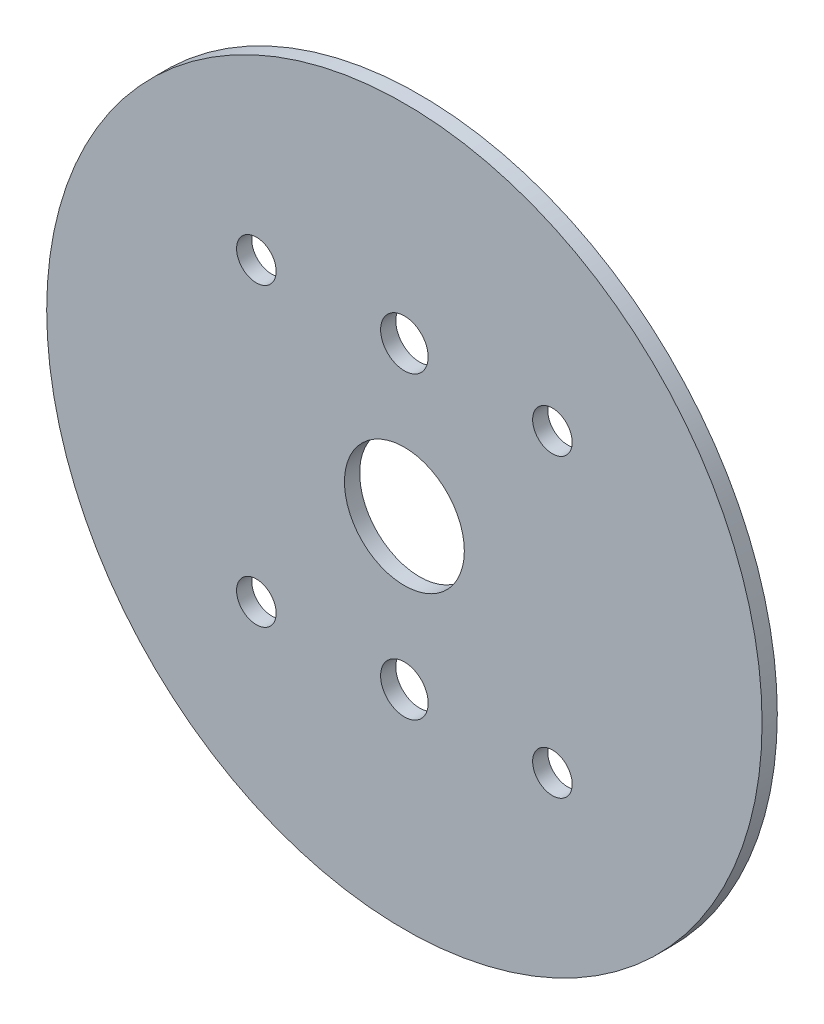
ISO-10303-21;
HEADER;
FILE_DESCRIPTION(('STEP AP214'),'2;1');
FILE_NAME('part.step','',(''),(''),'','','');
FILE_SCHEMA(('AUTOMOTIVE_DESIGN { 1 0 10303 214 1 1 1 1 }'));
ENDSEC;
DATA;
#1=APPLICATION_CONTEXT('core data for automotive mechanical design processes');
#2=APPLICATION_PROTOCOL_DEFINITION('international standard','automotive_design',2000,#1);
#3=PRODUCT_CONTEXT('',#1,'mechanical');
#4=PRODUCT('Part','Part','',(#3));
#5=PRODUCT_RELATED_PRODUCT_CATEGORY('part','',(#4));
#6=PRODUCT_DEFINITION_FORMATION('','',#4);
#7=PRODUCT_DEFINITION_CONTEXT('part definition',#1,'design');
#8=PRODUCT_DEFINITION('design','',#6,#7);
#9=PRODUCT_DEFINITION_SHAPE('','',#8);
#10=(LENGTH_UNIT() NAMED_UNIT(*) SI_UNIT(.MILLI.,.METRE.));
#11=(NAMED_UNIT(*) PLANE_ANGLE_UNIT() SI_UNIT($,.RADIAN.));
#12=(NAMED_UNIT(*) SI_UNIT($,.STERADIAN.) SOLID_ANGLE_UNIT());
#13=UNCERTAINTY_MEASURE_WITH_UNIT(LENGTH_MEASURE(1.E-05),#10,'distance_accuracy_value','');
#14=(GEOMETRIC_REPRESENTATION_CONTEXT(3) GLOBAL_UNCERTAINTY_ASSIGNED_CONTEXT((#13)) GLOBAL_UNIT_ASSIGNED_CONTEXT((#10,
#11,#12)) REPRESENTATION_CONTEXT('',''));
#15=CARTESIAN_POINT('',(0.,0.,0.));
#16=DIRECTION('',(0.,0.,1.));
#17=DIRECTION('',(1.,0.,0.));
#18=AXIS2_PLACEMENT_3D('',#15,#16,#17);
#19=CARTESIAN_POINT('',(0.,0.,1.016));
#20=DIRECTION('',(0.,0.,1.));
#21=DIRECTION('',(1.,0.,0.));
#22=AXIS2_PLACEMENT_3D('',#19,#20,#21);
#23=PLANE('',#22);
#24=CARTESIAN_POINT('',(-9.87828173317578,9.87828173317581,1.016));
#25=DIRECTION('',(0.,0.,1.));
#26=DIRECTION('',(1.,0.,0.));
#27=AXIS2_PLACEMENT_3D('',#24,#25,#26);
#28=CIRCLE('',#27,1.32080000000039);
#29=CARTESIAN_POINT('',(-8.55748173317538,9.87828173317581,1.016));
#30=VERTEX_POINT('',#29);
#31=EDGE_CURVE('E71',#30,#30,#28,.T.);
#32=ORIENTED_EDGE('',*,*,#31,.F.);
#33=EDGE_LOOP('',(#32));
#34=FACE_BOUND('',#33,.T.);
#35=CARTESIAN_POINT('',(9.87828173317605,-9.87828173317609,1.016));
#36=DIRECTION('',(0.,0.,1.));
#37=DIRECTION('',(1.,0.,0.));
#38=AXIS2_PLACEMENT_3D('',#35,#36,#37);
#39=CIRCLE('',#38,1.3208);
#40=CARTESIAN_POINT('',(11.1990817331761,-9.87828173317609,1.016));
#41=VERTEX_POINT('',#40);
#42=EDGE_CURVE('E59',#41,#41,#39,.T.);
#43=ORIENTED_EDGE('',*,*,#42,.F.);
#44=EDGE_LOOP('',(#43));
#45=FACE_BOUND('',#44,.T.);
#46=CARTESIAN_POINT('',(0.,0.,1.016));
#47=DIRECTION('',(0.,0.,1.));
#48=DIRECTION('',(1.,0.,0.));
#49=AXIS2_PLACEMENT_3D('',#46,#47,#48);
#50=CIRCLE('',#49,4.);
#51=CARTESIAN_POINT('',(4.,0.,1.016));
#52=VERTEX_POINT('',#51);
#53=EDGE_CURVE('E47',#52,#52,#50,.T.);
#54=ORIENTED_EDGE('',*,*,#53,.F.);
#55=EDGE_LOOP('',(#54));
#56=FACE_BOUND('',#55,.T.);
#57=CARTESIAN_POINT('',(0.,0.,1.016));
#58=DIRECTION('',(0.,0.,1.));
#59=DIRECTION('',(1.,0.,0.));
#60=AXIS2_PLACEMENT_3D('',#57,#58,#59);
#61=CIRCLE('',#60,23.87);
#62=CARTESIAN_POINT('',(23.87,0.,1.016));
#63=VERTEX_POINT('',#62);
#64=EDGE_CURVE('E10',#63,#63,#61,.T.);
#65=ORIENTED_EDGE('',*,*,#64,.T.);
#66=EDGE_LOOP('',(#65));
#67=FACE_BOUND('',#66,.T.);
#68=CARTESIAN_POINT('',(0.,10.,1.016));
#69=DIRECTION('',(0.,0.,1.));
#70=DIRECTION('',(1.,0.,0.));
#71=AXIS2_PLACEMENT_3D('',#68,#69,#70);
#72=CIRCLE('',#71,1.5875);
#73=CARTESIAN_POINT('',(1.5875,10.,1.016));
#74=VERTEX_POINT('',#73);
#75=EDGE_CURVE('E42',#74,#74,#72,.T.);
#76=ORIENTED_EDGE('',*,*,#75,.F.);
#77=EDGE_LOOP('',(#76));
#78=FACE_BOUND('',#77,.T.);
#79=CARTESIAN_POINT('',(9.87828173317609,9.87828173317578,1.016));
#80=DIRECTION('',(0.,0.,1.));
#81=DIRECTION('',(1.,0.,0.));
#82=AXIS2_PLACEMENT_3D('',#79,#80,#81);
#83=CIRCLE('',#82,1.32080000000006);
#84=CARTESIAN_POINT('',(11.1990817331761,9.87828173317578,1.016));
#85=VERTEX_POINT('',#84);
#86=EDGE_CURVE('E53',#85,#85,#83,.T.);
#87=ORIENTED_EDGE('',*,*,#86,.F.);
#88=EDGE_LOOP('',(#87));
#89=FACE_BOUND('',#88,.T.);
#90=CARTESIAN_POINT('',(-9.87828173317581,-9.87828173317605,1.016));
#91=DIRECTION('',(0.,0.,1.));
#92=DIRECTION('',(1.,0.,0.));
#93=AXIS2_PLACEMENT_3D('',#90,#91,#92);
#94=CIRCLE('',#93,1.32080000000029);
#95=CARTESIAN_POINT('',(-8.55748173317552,-9.87828173317605,1.016));
#96=VERTEX_POINT('',#95);
#97=EDGE_CURVE('E65',#96,#96,#94,.T.);
#98=ORIENTED_EDGE('',*,*,#97,.F.);
#99=EDGE_LOOP('',(#98));
#100=FACE_BOUND('',#99,.T.);
#101=CARTESIAN_POINT('',(2.8176792204172E-13,-10.,1.016));
#102=DIRECTION('',(0.,0.,1.));
#103=DIRECTION('',(1.,0.,0.));
#104=AXIS2_PLACEMENT_3D('',#101,#102,#103);
#105=CIRCLE('',#104,1.5875);
#106=CARTESIAN_POINT('',(1.58750000000028,-10.,1.016));
#107=VERTEX_POINT('',#106);
#108=EDGE_CURVE('E77',#107,#107,#105,.T.);
#109=ORIENTED_EDGE('',*,*,#108,.F.);
#110=EDGE_LOOP('',(#109));
#111=FACE_BOUND('',#110,.T.);
#112=ADVANCED_FACE('F31',(#34,#45,#56,#67,#78,#89,#100,#111),#23,.T.);
#113=CARTESIAN_POINT('',(0.,0.,0.));
#114=DIRECTION('',(0.,0.,1.));
#115=DIRECTION('',(1.,0.,0.));
#116=AXIS2_PLACEMENT_3D('',#113,#114,#115);
#117=PLANE('',#116);
#118=CARTESIAN_POINT('',(-9.87828173317578,9.87828173317581,0.));
#119=DIRECTION('',(0.,0.,1.));
#120=DIRECTION('',(1.,0.,0.));
#121=AXIS2_PLACEMENT_3D('',#118,#119,#120);
#122=CIRCLE('',#121,1.32080000000039);
#123=CARTESIAN_POINT('',(-8.55748173317538,9.87828173317581,0.));
#124=VERTEX_POINT('',#123);
#125=EDGE_CURVE('E74',#124,#124,#122,.T.);
#126=ORIENTED_EDGE('',*,*,#125,.T.);
#127=EDGE_LOOP('',(#126));
#128=FACE_BOUND('',#127,.T.);
#129=CARTESIAN_POINT('',(9.87828173317605,-9.87828173317609,0.));
#130=DIRECTION('',(0.,0.,1.));
#131=DIRECTION('',(1.,0.,0.));
#132=AXIS2_PLACEMENT_3D('',#129,#130,#131);
#133=CIRCLE('',#132,1.3208);
#134=CARTESIAN_POINT('',(11.1990817331761,-9.87828173317609,0.));
#135=VERTEX_POINT('',#134);
#136=EDGE_CURVE('E62',#135,#135,#133,.T.);
#137=ORIENTED_EDGE('',*,*,#136,.T.);
#138=EDGE_LOOP('',(#137));
#139=FACE_BOUND('',#138,.T.);
#140=CARTESIAN_POINT('',(0.,0.,0.));
#141=DIRECTION('',(0.,0.,1.));
#142=DIRECTION('',(1.,0.,0.));
#143=AXIS2_PLACEMENT_3D('',#140,#141,#142);
#144=CIRCLE('',#143,4.);
#145=CARTESIAN_POINT('',(4.,0.,0.));
#146=VERTEX_POINT('',#145);
#147=EDGE_CURVE('E50',#146,#146,#144,.T.);
#148=ORIENTED_EDGE('',*,*,#147,.T.);
#149=EDGE_LOOP('',(#148));
#150=FACE_BOUND('',#149,.T.);
#151=CARTESIAN_POINT('',(0.,0.,0.));
#152=DIRECTION('',(0.,0.,1.));
#153=DIRECTION('',(1.,0.,0.));
#154=AXIS2_PLACEMENT_3D('',#151,#152,#153);
#155=CIRCLE('',#154,23.87);
#156=CARTESIAN_POINT('',(23.87,0.,0.));
#157=VERTEX_POINT('',#156);
#158=EDGE_CURVE('E35',#157,#157,#155,.T.);
#159=ORIENTED_EDGE('',*,*,#158,.F.);
#160=EDGE_LOOP('',(#159));
#161=FACE_BOUND('',#160,.T.);
#162=CARTESIAN_POINT('',(0.,10.,0.));
#163=DIRECTION('',(0.,0.,1.));
#164=DIRECTION('',(1.,0.,0.));
#165=AXIS2_PLACEMENT_3D('',#162,#163,#164);
#166=CIRCLE('',#165,1.5875);
#167=CARTESIAN_POINT('',(1.5875,10.,0.));
#168=VERTEX_POINT('',#167);
#169=EDGE_CURVE('E44',#168,#168,#166,.T.);
#170=ORIENTED_EDGE('',*,*,#169,.T.);
#171=EDGE_LOOP('',(#170));
#172=FACE_BOUND('',#171,.T.);
#173=CARTESIAN_POINT('',(9.87828173317609,9.87828173317578,0.));
#174=DIRECTION('',(0.,0.,1.));
#175=DIRECTION('',(1.,0.,0.));
#176=AXIS2_PLACEMENT_3D('',#173,#174,#175);
#177=CIRCLE('',#176,1.32080000000006);
#178=CARTESIAN_POINT('',(11.1990817331761,9.87828173317578,0.));
#179=VERTEX_POINT('',#178);
#180=EDGE_CURVE('E56',#179,#179,#177,.T.);
#181=ORIENTED_EDGE('',*,*,#180,.T.);
#182=EDGE_LOOP('',(#181));
#183=FACE_BOUND('',#182,.T.);
#184=CARTESIAN_POINT('',(-9.87828173317581,-9.87828173317605,0.));
#185=DIRECTION('',(0.,0.,1.));
#186=DIRECTION('',(1.,0.,0.));
#187=AXIS2_PLACEMENT_3D('',#184,#185,#186);
#188=CIRCLE('',#187,1.32080000000029);
#189=CARTESIAN_POINT('',(-8.55748173317552,-9.87828173317605,0.));
#190=VERTEX_POINT('',#189);
#191=EDGE_CURVE('E68',#190,#190,#188,.T.);
#192=ORIENTED_EDGE('',*,*,#191,.T.);
#193=EDGE_LOOP('',(#192));
#194=FACE_BOUND('',#193,.T.);
#195=CARTESIAN_POINT('',(2.8176792204172E-13,-10.,0.));
#196=DIRECTION('',(0.,0.,1.));
#197=DIRECTION('',(1.,0.,0.));
#198=AXIS2_PLACEMENT_3D('',#195,#196,#197);
#199=CIRCLE('',#198,1.5875);
#200=CARTESIAN_POINT('',(1.58750000000028,-10.,0.));
#201=VERTEX_POINT('',#200);
#202=EDGE_CURVE('E80',#201,#201,#199,.T.);
#203=ORIENTED_EDGE('',*,*,#202,.T.);
#204=EDGE_LOOP('',(#203));
#205=FACE_BOUND('',#204,.T.);
#206=ADVANCED_FACE('F90',(#128,#139,#150,#161,#172,#183,#194,#205),#117,.F.);
#207=CARTESIAN_POINT('',(0.,0.,1.016));
#208=DIRECTION('',(0.,0.,-1.));
#209=DIRECTION('',(-1.,0.,0.));
#210=AXIS2_PLACEMENT_3D('',#207,#208,#209);
#211=CYLINDRICAL_SURFACE('',#210,23.87);
#212=ORIENTED_EDGE('',*,*,#64,.F.);
#213=EDGE_LOOP('',(#212));
#214=FACE_BOUND('',#213,.T.);
#215=ORIENTED_EDGE('',*,*,#158,.T.);
#216=EDGE_LOOP('',(#215));
#217=FACE_BOUND('',#216,.T.);
#218=ADVANCED_FACE('F33',(#214,#217),#211,.T.);
#219=CARTESIAN_POINT('',(0.,10.,1.016));
#220=DIRECTION('',(0.,0.,-1.));
#221=DIRECTION('',(-1.,0.,0.));
#222=AXIS2_PLACEMENT_3D('',#219,#220,#221);
#223=CYLINDRICAL_SURFACE('',#222,1.5875);
#224=ORIENTED_EDGE('',*,*,#75,.T.);
#225=EDGE_LOOP('',(#224));
#226=FACE_BOUND('',#225,.T.);
#227=ORIENTED_EDGE('',*,*,#169,.F.);
#228=EDGE_LOOP('',(#227));
#229=FACE_BOUND('',#228,.T.);
#230=ADVANCED_FACE('F100',(#226,#229),#223,.F.);
#231=CARTESIAN_POINT('',(0.,0.,1.016));
#232=DIRECTION('',(0.,0.,-1.));
#233=DIRECTION('',(-1.,0.,0.));
#234=AXIS2_PLACEMENT_3D('',#231,#232,#233);
#235=CYLINDRICAL_SURFACE('',#234,4.);
#236=ORIENTED_EDGE('',*,*,#53,.T.);
#237=EDGE_LOOP('',(#236));
#238=FACE_BOUND('',#237,.T.);
#239=ORIENTED_EDGE('',*,*,#147,.F.);
#240=EDGE_LOOP('',(#239));
#241=FACE_BOUND('',#240,.T.);
#242=ADVANCED_FACE('F103',(#238,#241),#235,.F.);
#243=CARTESIAN_POINT('',(9.87828173317609,9.87828173317578,1.016));
#244=DIRECTION('',(0.,0.,-1.));
#245=DIRECTION('',(-1.,0.,0.));
#246=AXIS2_PLACEMENT_3D('',#243,#244,#245);
#247=CYLINDRICAL_SURFACE('',#246,1.32080000000006);
#248=ORIENTED_EDGE('',*,*,#86,.T.);
#249=EDGE_LOOP('',(#248));
#250=FACE_BOUND('',#249,.T.);
#251=ORIENTED_EDGE('',*,*,#180,.F.);
#252=EDGE_LOOP('',(#251));
#253=FACE_BOUND('',#252,.T.);
#254=ADVANCED_FACE('F107',(#250,#253),#247,.F.);
#255=CARTESIAN_POINT('',(9.87828173317605,-9.87828173317609,1.016));
#256=DIRECTION('',(0.,0.,-1.));
#257=DIRECTION('',(-1.,0.,0.));
#258=AXIS2_PLACEMENT_3D('',#255,#256,#257);
#259=CYLINDRICAL_SURFACE('',#258,1.3208);
#260=ORIENTED_EDGE('',*,*,#42,.T.);
#261=EDGE_LOOP('',(#260));
#262=FACE_BOUND('',#261,.T.);
#263=ORIENTED_EDGE('',*,*,#136,.F.);
#264=EDGE_LOOP('',(#263));
#265=FACE_BOUND('',#264,.T.);
#266=ADVANCED_FACE('F111',(#262,#265),#259,.F.);
#267=CARTESIAN_POINT('',(-9.87828173317581,-9.87828173317605,1.016));
#268=DIRECTION('',(0.,0.,-1.));
#269=DIRECTION('',(-1.,0.,0.));
#270=AXIS2_PLACEMENT_3D('',#267,#268,#269);
#271=CYLINDRICAL_SURFACE('',#270,1.32080000000029);
#272=ORIENTED_EDGE('',*,*,#97,.T.);
#273=EDGE_LOOP('',(#272));
#274=FACE_BOUND('',#273,.T.);
#275=ORIENTED_EDGE('',*,*,#191,.F.);
#276=EDGE_LOOP('',(#275));
#277=FACE_BOUND('',#276,.T.);
#278=ADVANCED_FACE('F115',(#274,#277),#271,.F.);
#279=CARTESIAN_POINT('',(-9.87828173317578,9.87828173317581,1.016));
#280=DIRECTION('',(0.,0.,-1.));
#281=DIRECTION('',(-1.,0.,0.));
#282=AXIS2_PLACEMENT_3D('',#279,#280,#281);
#283=CYLINDRICAL_SURFACE('',#282,1.32080000000039);
#284=ORIENTED_EDGE('',*,*,#31,.T.);
#285=EDGE_LOOP('',(#284));
#286=FACE_BOUND('',#285,.T.);
#287=ORIENTED_EDGE('',*,*,#125,.F.);
#288=EDGE_LOOP('',(#287));
#289=FACE_BOUND('',#288,.T.);
#290=ADVANCED_FACE('F119',(#286,#289),#283,.F.);
#291=CARTESIAN_POINT('',(2.8176792204172E-13,-10.,1.016));
#292=DIRECTION('',(0.,0.,-1.));
#293=DIRECTION('',(-1.,0.,0.));
#294=AXIS2_PLACEMENT_3D('',#291,#292,#293);
#295=CYLINDRICAL_SURFACE('',#294,1.5875);
#296=ORIENTED_EDGE('',*,*,#108,.T.);
#297=EDGE_LOOP('',(#296));
#298=FACE_BOUND('',#297,.T.);
#299=ORIENTED_EDGE('',*,*,#202,.F.);
#300=EDGE_LOOP('',(#299));
#301=FACE_BOUND('',#300,.T.);
#302=ADVANCED_FACE('F86',(#298,#301),#295,.F.);
#303=CLOSED_SHELL('',(#112,#206,#218,#230,#242,#254,#266,#278,#290,#302));
#304=MANIFOLD_SOLID_BREP('B2',#303);
#305=ADVANCED_BREP_SHAPE_REPRESENTATION('',(#18,#304),#14);
#306=SHAPE_DEFINITION_REPRESENTATION(#9,#305);
ENDSEC;
END-ISO-10303-21;
